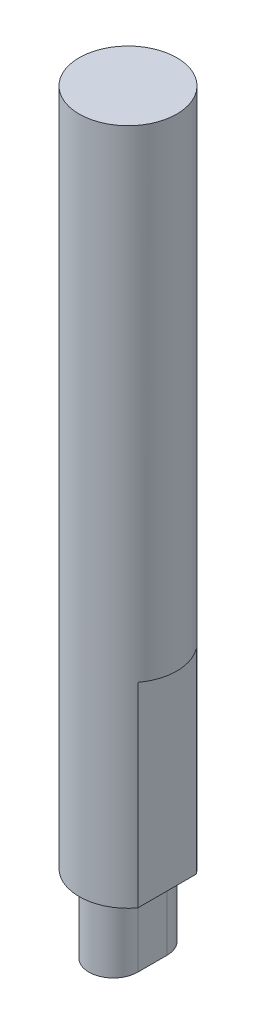
ISO-10303-21;
HEADER;
FILE_DESCRIPTION(('STEP AP214'),'2;1');
FILE_NAME('part.step','',(''),(''),'','','');
FILE_SCHEMA(('AUTOMOTIVE_DESIGN { 1 0 10303 214 1 1 1 1 }'));
ENDSEC;
DATA;
#1=APPLICATION_CONTEXT('core data for automotive mechanical design processes');
#2=APPLICATION_PROTOCOL_DEFINITION('international standard','automotive_design',2000,#1);
#3=PRODUCT_CONTEXT('',#1,'mechanical');
#4=PRODUCT('Part','Part','',(#3));
#5=PRODUCT_RELATED_PRODUCT_CATEGORY('part','',(#4));
#6=PRODUCT_DEFINITION_FORMATION('','',#4);
#7=PRODUCT_DEFINITION_CONTEXT('part definition',#1,'design');
#8=PRODUCT_DEFINITION('design','',#6,#7);
#9=PRODUCT_DEFINITION_SHAPE('','',#8);
#10=(LENGTH_UNIT() NAMED_UNIT(*) SI_UNIT(.MILLI.,.METRE.));
#11=(NAMED_UNIT(*) PLANE_ANGLE_UNIT() SI_UNIT($,.RADIAN.));
#12=(NAMED_UNIT(*) SI_UNIT($,.STERADIAN.) SOLID_ANGLE_UNIT());
#13=UNCERTAINTY_MEASURE_WITH_UNIT(LENGTH_MEASURE(1.E-05),#10,'distance_accuracy_value','');
#14=(GEOMETRIC_REPRESENTATION_CONTEXT(3) GLOBAL_UNCERTAINTY_ASSIGNED_CONTEXT((#13)) GLOBAL_UNIT_ASSIGNED_CONTEXT((#10,
#11,#12)) REPRESENTATION_CONTEXT('',''));
#15=CARTESIAN_POINT('',(0.,0.,0.));
#16=DIRECTION('',(0.,0.,1.));
#17=DIRECTION('',(1.,0.,0.));
#18=AXIS2_PLACEMENT_3D('',#15,#16,#17);
#19=CARTESIAN_POINT('',(0.,50.,0.));
#20=DIRECTION('',(0.,-1.,0.));
#21=DIRECTION('',(0.,0.,-1.));
#22=AXIS2_PLACEMENT_3D('',#19,#20,#21);
#23=CYLINDRICAL_SURFACE('',#22,2.5);
#24=CARTESIAN_POINT('',(0.,5.30454762937497,0.));
#25=DIRECTION('',(0.,-1.,0.));
#26=DIRECTION('',(0.,0.,-1.));
#27=AXIS2_PLACEMENT_3D('',#24,#25,#26);
#28=CIRCLE('',#27,2.5);
#29=CARTESIAN_POINT('',(-2.,5.30454762937497,1.5));
#30=VERTEX_POINT('',#29);
#31=CARTESIAN_POINT('',(-2.,5.30454762937497,-1.50000000000001));
#32=VERTEX_POINT('',#31);
#33=EDGE_CURVE('E105',#30,#32,#28,.T.);
#34=ORIENTED_EDGE('',*,*,#33,.F.);
#35=DIRECTION('',(0.,-1.,0.));
#36=VECTOR('',#35,1.);
#37=CARTESIAN_POINT('',(-2.,5.30454762937497,1.5));
#38=LINE('',#37,#36);
#39=CARTESIAN_POINT('',(-2.,-4.69545237062503,1.50000000000001));
#40=VERTEX_POINT('',#39);
#41=EDGE_CURVE('E113',#30,#40,#38,.T.);
#42=ORIENTED_EDGE('',*,*,#41,.T.);
#43=CARTESIAN_POINT('',(0.,-4.69545237062503,0.));
#44=DIRECTION('',(0.,-1.,0.));
#45=DIRECTION('',(0.,0.,-1.));
#46=AXIS2_PLACEMENT_3D('',#43,#44,#45);
#47=CIRCLE('',#46,2.5);
#48=CARTESIAN_POINT('',(2.,-4.69545237062502,1.49999999999999));
#49=VERTEX_POINT('',#48);
#50=EDGE_CURVE('E13',#49,#40,#47,.T.);
#51=ORIENTED_EDGE('',*,*,#50,.F.);
#52=DIRECTION('',(0.,-1.,0.));
#53=VECTOR('',#52,1.);
#54=CARTESIAN_POINT('',(2.,5.30454762937497,1.49999999999999));
#55=LINE('',#54,#53);
#56=CARTESIAN_POINT('',(2.,5.30454762937497,1.49999999999999));
#57=VERTEX_POINT('',#56);
#58=EDGE_CURVE('E61',#57,#49,#55,.T.);
#59=ORIENTED_EDGE('',*,*,#58,.F.);
#60=CARTESIAN_POINT('',(0.,5.30454762937497,0.));
#61=DIRECTION('',(0.,-1.,0.));
#62=DIRECTION('',(0.,0.,1.));
#63=AXIS2_PLACEMENT_3D('',#60,#61,#62);
#64=CIRCLE('',#63,2.49999999999999);
#65=CARTESIAN_POINT('',(2.,5.30454762937497,-1.49999999999999));
#66=VERTEX_POINT('',#65);
#67=EDGE_CURVE('E131',#66,#57,#64,.T.);
#68=ORIENTED_EDGE('',*,*,#67,.F.);
#69=DIRECTION('',(0.,-1.,0.));
#70=VECTOR('',#69,1.);
#71=CARTESIAN_POINT('',(2.,5.30454762937497,-1.49999999999999));
#72=LINE('',#71,#70);
#73=CARTESIAN_POINT('',(2.,-4.69545237062503,-1.49999999999999));
#74=VERTEX_POINT('',#73);
#75=EDGE_CURVE('E126',#66,#74,#72,.T.);
#76=ORIENTED_EDGE('',*,*,#75,.T.);
#77=CARTESIAN_POINT('',(-2.,-4.69545237062503,-1.50000000000001));
#78=VERTEX_POINT('',#77);
#79=EDGE_CURVE('E42',#78,#74,#47,.T.);
#80=ORIENTED_EDGE('',*,*,#79,.F.);
#81=DIRECTION('',(0.,-1.,0.));
#82=VECTOR('',#81,1.);
#83=CARTESIAN_POINT('',(-2.,5.30454762937497,-1.50000000000001));
#84=LINE('',#83,#82);
#85=EDGE_CURVE('E53',#32,#78,#84,.T.);
#86=ORIENTED_EDGE('',*,*,#85,.F.);
#87=EDGE_LOOP('',(#34,#42,#51,#59,#68,#76,#80,#86));
#88=FACE_BOUND('',#87,.T.);
#89=CARTESIAN_POINT('',(0.,30.,0.));
#90=DIRECTION('',(0.,1.,0.));
#91=DIRECTION('',(0.,0.,1.));
#92=AXIS2_PLACEMENT_3D('',#89,#90,#91);
#93=CIRCLE('',#92,2.5);
#94=CARTESIAN_POINT('',(0.,30.,2.5));
#95=VERTEX_POINT('',#94);
#96=EDGE_CURVE('E128',#95,#95,#93,.T.);
#97=ORIENTED_EDGE('',*,*,#96,.F.);
#98=EDGE_LOOP('',(#97));
#99=FACE_BOUND('',#98,.T.);
#100=ADVANCED_FACE('F39',(#88,#99),#23,.T.);
#101=CARTESIAN_POINT('',(0.,-4.69545237062503,0.));
#102=DIRECTION('',(0.,-1.,0.));
#103=DIRECTION('',(0.,0.,-1.));
#104=AXIS2_PLACEMENT_3D('',#101,#102,#103);
#105=PLANE('',#104);
#106=DIRECTION('',(0.,0.,1.));
#107=VECTOR('',#106,1.);
#108=CARTESIAN_POINT('',(-2.,-4.69545237062503,1.50000000000001));
#109=LINE('',#108,#107);
#110=EDGE_CURVE('E110',#78,#40,#109,.T.);
#111=ORIENTED_EDGE('',*,*,#110,.F.);
#112=ORIENTED_EDGE('',*,*,#79,.T.);
#113=DIRECTION('',(0.,0.,-1.));
#114=VECTOR('',#113,1.);
#115=CARTESIAN_POINT('',(2.,-4.69545237062503,1.49999999999999));
#116=LINE('',#115,#114);
#117=EDGE_CURVE('E129',#49,#74,#116,.T.);
#118=ORIENTED_EDGE('',*,*,#117,.F.);
#119=ORIENTED_EDGE('',*,*,#50,.T.);
#120=EDGE_LOOP('',(#111,#112,#118,#119));
#121=FACE_BOUND('',#120,.T.);
#122=DIRECTION('',(0.,0.,1.));
#123=VECTOR('',#122,1.);
#124=CARTESIAN_POINT('',(1.25,-4.69545237062503,0.750000000000004));
#125=LINE('',#124,#123);
#126=CARTESIAN_POINT('',(1.25,-4.69545237062503,-0.749999999999996));
#127=VERTEX_POINT('',#126);
#128=CARTESIAN_POINT('',(1.25,-4.69545237062503,0.750000000000004));
#129=VERTEX_POINT('',#128);
#130=EDGE_CURVE('E145',#127,#129,#125,.T.);
#131=ORIENTED_EDGE('',*,*,#130,.F.);
#132=CARTESIAN_POINT('',(0.,-4.69545237062503,-0.749999999999996));
#133=DIRECTION('',(0.,-1.,0.));
#134=DIRECTION('',(0.,0.,-1.));
#135=AXIS2_PLACEMENT_3D('',#132,#133,#134);
#136=CIRCLE('',#135,1.25);
#137=CARTESIAN_POINT('',(-1.25,-4.69545237062503,-0.749999999999996));
#138=VERTEX_POINT('',#137);
#139=EDGE_CURVE('E142',#138,#127,#136,.T.);
#140=ORIENTED_EDGE('',*,*,#139,.F.);
#141=DIRECTION('',(0.,0.,-1.));
#142=VECTOR('',#141,1.);
#143=CARTESIAN_POINT('',(-1.25,-4.69545237062503,0.750000000000004));
#144=LINE('',#143,#142);
#145=CARTESIAN_POINT('',(-1.25,-4.69545237062503,0.750000000000004));
#146=VERTEX_POINT('',#145);
#147=EDGE_CURVE('E138',#146,#138,#144,.T.);
#148=ORIENTED_EDGE('',*,*,#147,.F.);
#149=CARTESIAN_POINT('',(0.,-4.69545237062503,0.750000000000004));
#150=DIRECTION('',(0.,-1.,0.));
#151=DIRECTION('',(0.,0.,-1.));
#152=AXIS2_PLACEMENT_3D('',#149,#150,#151);
#153=CIRCLE('',#152,1.25);
#154=EDGE_CURVE('E135',#129,#146,#153,.T.);
#155=ORIENTED_EDGE('',*,*,#154,.F.);
#156=EDGE_LOOP('',(#131,#140,#148,#155));
#157=FACE_BOUND('',#156,.T.);
#158=ADVANCED_FACE('F181',(#121,#157),#105,.T.);
#159=CARTESIAN_POINT('',(0.,-4.69545237062503,0.750000000000004));
#160=DIRECTION('',(0.,-1.,0.));
#161=DIRECTION('',(0.,0.,-1.));
#162=AXIS2_PLACEMENT_3D('',#159,#160,#161);
#163=CYLINDRICAL_SURFACE('',#162,1.25);
#164=CARTESIAN_POINT('',(0.,-8.29545237062503,0.750000000000007));
#165=DIRECTION('',(0.,-1.,0.));
#166=DIRECTION('',(0.,0.,-1.));
#167=AXIS2_PLACEMENT_3D('',#164,#165,#166);
#168=CIRCLE('',#167,1.25);
#169=CARTESIAN_POINT('',(1.25000000000001,-8.29545237062503,0.750000000000007));
#170=VERTEX_POINT('',#169);
#171=CARTESIAN_POINT('',(-1.24999999999999,-8.29545237062503,0.750000000000008));
#172=VERTEX_POINT('',#171);
#173=EDGE_CURVE('E120',#170,#172,#168,.T.);
#174=ORIENTED_EDGE('',*,*,#173,.F.);
#175=DIRECTION('',(0.,-1.,0.));
#176=VECTOR('',#175,1.);
#177=CARTESIAN_POINT('',(1.25,-4.69545237062503,0.750000000000004));
#178=LINE('',#177,#176);
#179=EDGE_CURVE('E159',#129,#170,#178,.T.);
#180=ORIENTED_EDGE('',*,*,#179,.F.);
#181=ORIENTED_EDGE('',*,*,#154,.T.);
#182=DIRECTION('',(0.,-1.,0.));
#183=VECTOR('',#182,1.);
#184=CARTESIAN_POINT('',(-1.25,-4.69545237062503,0.750000000000004));
#185=LINE('',#184,#183);
#186=EDGE_CURVE('E148',#146,#172,#185,.T.);
#187=ORIENTED_EDGE('',*,*,#186,.T.);
#188=EDGE_LOOP('',(#174,#180,#181,#187));
#189=FACE_BOUND('',#188,.T.);
#190=ADVANCED_FACE('F168',(#189),#163,.T.);
#191=CARTESIAN_POINT('',(1.25,-4.69545237062503,0.750000000000004));
#192=DIRECTION('',(1.,0.,0.));
#193=DIRECTION('',(0.,1.,0.));
#194=AXIS2_PLACEMENT_3D('',#191,#192,#193);
#195=PLANE('',#194);
#196=DIRECTION('',(0.,0.,1.));
#197=VECTOR('',#196,1.);
#198=CARTESIAN_POINT('',(1.25000000000001,-8.29545237062503,0.750000000000007));
#199=LINE('',#198,#197);
#200=CARTESIAN_POINT('',(1.25000000000001,-8.29545237062503,-0.749999999999993));
#201=VERTEX_POINT('',#200);
#202=EDGE_CURVE('E139',#201,#170,#199,.T.);
#203=ORIENTED_EDGE('',*,*,#202,.F.);
#204=DIRECTION('',(0.,-1.,0.));
#205=VECTOR('',#204,1.);
#206=CARTESIAN_POINT('',(1.25,-4.69545237062503,-0.749999999999996));
#207=LINE('',#206,#205);
#208=EDGE_CURVE('E161',#127,#201,#207,.T.);
#209=ORIENTED_EDGE('',*,*,#208,.F.);
#210=ORIENTED_EDGE('',*,*,#130,.T.);
#211=ORIENTED_EDGE('',*,*,#179,.T.);
#212=EDGE_LOOP('',(#203,#209,#210,#211));
#213=FACE_BOUND('',#212,.T.);
#214=ADVANCED_FACE('F178',(#213),#195,.T.);
#215=CARTESIAN_POINT('',(0.,-4.69545237062503,-0.749999999999996));
#216=DIRECTION('',(0.,-1.,0.));
#217=DIRECTION('',(0.,0.,-1.));
#218=AXIS2_PLACEMENT_3D('',#215,#216,#217);
#219=CYLINDRICAL_SURFACE('',#218,1.25);
#220=CARTESIAN_POINT('',(0.,-8.29545237062503,-0.749999999999993));
#221=DIRECTION('',(0.,-1.,0.));
#222=DIRECTION('',(0.,0.,-1.));
#223=AXIS2_PLACEMENT_3D('',#220,#221,#222);
#224=CIRCLE('',#223,1.25);
#225=CARTESIAN_POINT('',(-1.24999999999999,-8.29545237062503,-0.749999999999996));
#226=VERTEX_POINT('',#225);
#227=EDGE_CURVE('E154',#226,#201,#224,.T.);
#228=ORIENTED_EDGE('',*,*,#227,.F.);
#229=DIRECTION('',(0.,-1.,0.));
#230=VECTOR('',#229,1.);
#231=CARTESIAN_POINT('',(-1.25,-4.69545237062503,-0.749999999999996));
#232=LINE('',#231,#230);
#233=EDGE_CURVE('E163',#138,#226,#232,.T.);
#234=ORIENTED_EDGE('',*,*,#233,.F.);
#235=ORIENTED_EDGE('',*,*,#139,.T.);
#236=ORIENTED_EDGE('',*,*,#208,.T.);
#237=EDGE_LOOP('',(#228,#234,#235,#236));
#238=FACE_BOUND('',#237,.T.);
#239=ADVANCED_FACE('F183',(#238),#219,.T.);
#240=CARTESIAN_POINT('',(-1.25,-4.69545237062503,0.750000000000004));
#241=DIRECTION('',(-1.,0.,0.));
#242=DIRECTION('',(0.,-1.,0.));
#243=AXIS2_PLACEMENT_3D('',#240,#241,#242);
#244=PLANE('',#243);
#245=DIRECTION('',(0.,0.,-1.));
#246=VECTOR('',#245,1.);
#247=CARTESIAN_POINT('',(-1.24999999999999,-8.29545237062503,0.750000000000008));
#248=LINE('',#247,#246);
#249=EDGE_CURVE('E151',#172,#226,#248,.T.);
#250=ORIENTED_EDGE('',*,*,#249,.F.);
#251=ORIENTED_EDGE('',*,*,#186,.F.);
#252=ORIENTED_EDGE('',*,*,#147,.T.);
#253=ORIENTED_EDGE('',*,*,#233,.T.);
#254=EDGE_LOOP('',(#250,#251,#252,#253));
#255=FACE_BOUND('',#254,.T.);
#256=ADVANCED_FACE('F172',(#255),#244,.T.);
#257=CARTESIAN_POINT('',(0.135661582075452,-8.29545237062503,-0.737628588890849));
#258=DIRECTION('',(0.,1.,0.));
#259=DIRECTION('',(-0.18088210943354,0.,0.983504785187582));
#260=AXIS2_PLACEMENT_3D('',#257,#258,#259);
#261=PLANE('',#260);
#262=ORIENTED_EDGE('',*,*,#173,.T.);
#263=ORIENTED_EDGE('',*,*,#249,.T.);
#264=ORIENTED_EDGE('',*,*,#227,.T.);
#265=ORIENTED_EDGE('',*,*,#202,.T.);
#266=EDGE_LOOP('',(#262,#263,#264,#265));
#267=FACE_BOUND('',#266,.T.);
#268=ADVANCED_FACE('F175',(#267),#261,.F.);
#269=CARTESIAN_POINT('',(2.,5.30454762937497,1.49999999999999));
#270=DIRECTION('',(-1.,0.,0.));
#271=DIRECTION('',(0.,-1.,0.));
#272=AXIS2_PLACEMENT_3D('',#269,#270,#271);
#273=PLANE('',#272);
#274=ORIENTED_EDGE('',*,*,#117,.T.);
#275=ORIENTED_EDGE('',*,*,#75,.F.);
#276=DIRECTION('',(0.,0.,-1.));
#277=VECTOR('',#276,1.);
#278=CARTESIAN_POINT('',(2.,5.30454762937497,1.49999999999999));
#279=LINE('',#278,#277);
#280=EDGE_CURVE('E125',#57,#66,#279,.T.);
#281=ORIENTED_EDGE('',*,*,#280,.F.);
#282=ORIENTED_EDGE('',*,*,#58,.T.);
#283=EDGE_LOOP('',(#274,#275,#281,#282));
#284=FACE_BOUND('',#283,.T.);
#285=ADVANCED_FACE('F206',(#284),#273,.F.);
#286=CARTESIAN_POINT('',(0.,5.30454762937497,0.));
#287=DIRECTION('',(0.,1.,0.));
#288=DIRECTION('',(0.,0.,1.));
#289=AXIS2_PLACEMENT_3D('',#286,#287,#288);
#290=PLANE('',#289);
#291=ORIENTED_EDGE('',*,*,#67,.T.);
#292=ORIENTED_EDGE('',*,*,#280,.T.);
#293=EDGE_LOOP('',(#291,#292));
#294=FACE_BOUND('',#293,.T.);
#295=ADVANCED_FACE('F211',(#294),#290,.F.);
#296=CARTESIAN_POINT('',(-2.,5.30454762937497,1.5));
#297=DIRECTION('',(1.,0.,0.));
#298=DIRECTION('',(0.,1.,0.));
#299=AXIS2_PLACEMENT_3D('',#296,#297,#298);
#300=PLANE('',#299);
#301=ORIENTED_EDGE('',*,*,#110,.T.);
#302=ORIENTED_EDGE('',*,*,#41,.F.);
#303=DIRECTION('',(0.,0.,1.));
#304=VECTOR('',#303,1.);
#305=CARTESIAN_POINT('',(-2.,5.30454762937497,1.5));
#306=LINE('',#305,#304);
#307=EDGE_CURVE('E107',#32,#30,#306,.T.);
#308=ORIENTED_EDGE('',*,*,#307,.F.);
#309=ORIENTED_EDGE('',*,*,#85,.T.);
#310=EDGE_LOOP('',(#301,#302,#308,#309));
#311=FACE_BOUND('',#310,.T.);
#312=ADVANCED_FACE('F112',(#311),#300,.F.);
#313=CARTESIAN_POINT('',(0.,5.30454762937497,0.));
#314=DIRECTION('',(0.,-1.,0.));
#315=DIRECTION('',(0.,0.,-1.));
#316=AXIS2_PLACEMENT_3D('',#313,#314,#315);
#317=PLANE('',#316);
#318=ORIENTED_EDGE('',*,*,#33,.T.);
#319=ORIENTED_EDGE('',*,*,#307,.T.);
#320=EDGE_LOOP('',(#318,#319));
#321=FACE_BOUND('',#320,.T.);
#322=ADVANCED_FACE('F106',(#321),#317,.T.);
#323=CARTESIAN_POINT('',(0.,30.,0.));
#324=DIRECTION('',(0.,1.,0.));
#325=DIRECTION('',(0.,0.,1.));
#326=AXIS2_PLACEMENT_3D('',#323,#324,#325);
#327=PLANE('',#326);
#328=ORIENTED_EDGE('',*,*,#96,.T.);
#329=EDGE_LOOP('',(#328));
#330=FACE_BOUND('',#329,.T.);
#331=ADVANCED_FACE('F222',(#330),#327,.T.);
#332=CLOSED_SHELL('',(#100,#158,#190,#214,#239,#256,#268,#285,#295,#312,#322,#331));
#333=MANIFOLD_SOLID_BREP('B2',#332);
#334=ADVANCED_BREP_SHAPE_REPRESENTATION('',(#18,#333),#14);
#335=SHAPE_DEFINITION_REPRESENTATION(#9,#334);
ENDSEC;
END-ISO-10303-21;
